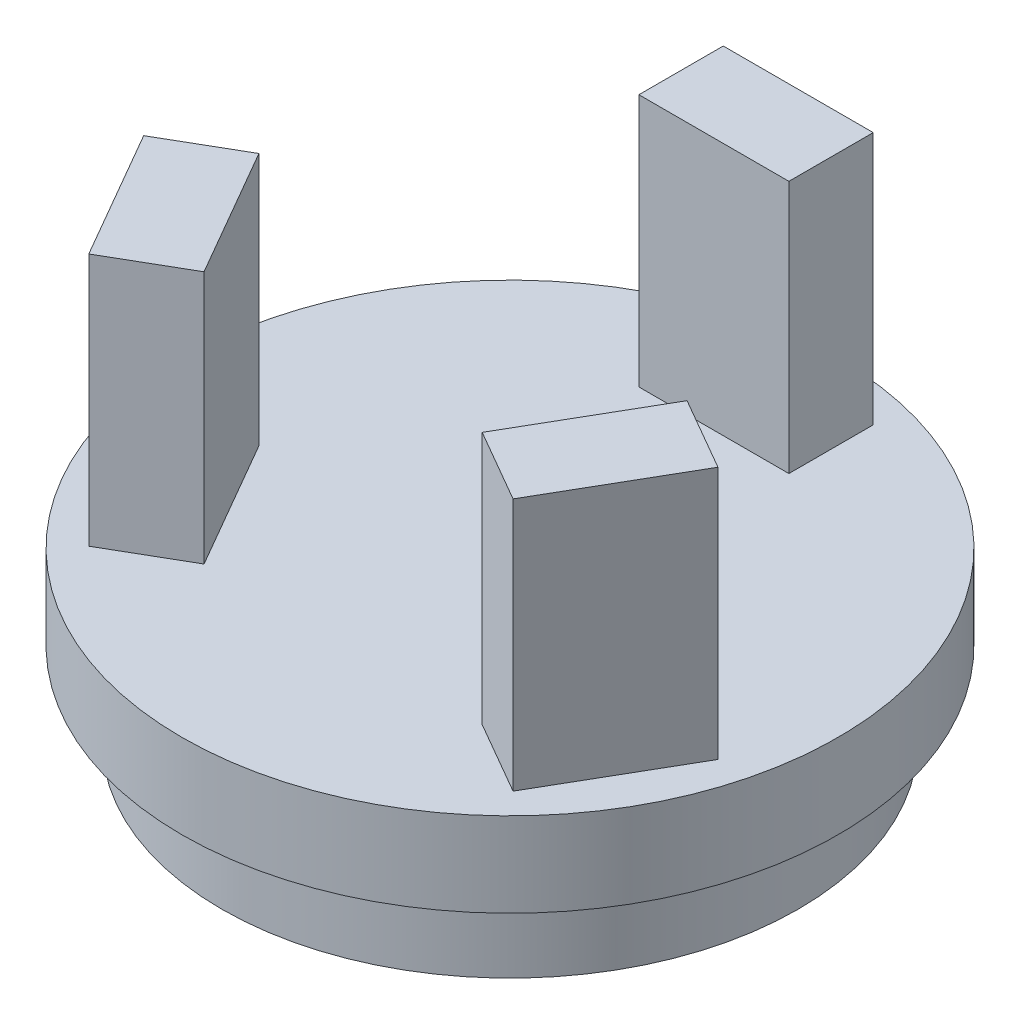
ISO-10303-21;
HEADER;
FILE_DESCRIPTION(('STEP AP214'),'2;1');
FILE_NAME('part.step','',(''),(''),'','','');
FILE_SCHEMA(('AUTOMOTIVE_DESIGN { 1 0 10303 214 1 1 1 1 }'));
ENDSEC;
DATA;
#1=APPLICATION_CONTEXT('core data for automotive mechanical design processes');
#2=APPLICATION_PROTOCOL_DEFINITION('international standard','automotive_design',2000,#1);
#3=PRODUCT_CONTEXT('',#1,'mechanical');
#4=PRODUCT('Part','Part','',(#3));
#5=PRODUCT_RELATED_PRODUCT_CATEGORY('part','',(#4));
#6=PRODUCT_DEFINITION_FORMATION('','',#4);
#7=PRODUCT_DEFINITION_CONTEXT('part definition',#1,'design');
#8=PRODUCT_DEFINITION('design','',#6,#7);
#9=PRODUCT_DEFINITION_SHAPE('','',#8);
#10=(LENGTH_UNIT() NAMED_UNIT(*) SI_UNIT(.MILLI.,.METRE.));
#11=(NAMED_UNIT(*) PLANE_ANGLE_UNIT() SI_UNIT($,.RADIAN.));
#12=(NAMED_UNIT(*) SI_UNIT($,.STERADIAN.) SOLID_ANGLE_UNIT());
#13=UNCERTAINTY_MEASURE_WITH_UNIT(LENGTH_MEASURE(1.E-05),#10,'distance_accuracy_value','');
#14=(GEOMETRIC_REPRESENTATION_CONTEXT(3) GLOBAL_UNCERTAINTY_ASSIGNED_CONTEXT((#13)) GLOBAL_UNIT_ASSIGNED_CONTEXT((#10,
#11,#12)) REPRESENTATION_CONTEXT('',''));
#15=CARTESIAN_POINT('',(0.,0.,0.));
#16=DIRECTION('',(0.,0.,1.));
#17=DIRECTION('',(1.,0.,0.));
#18=AXIS2_PLACEMENT_3D('',#15,#16,#17);
#19=CARTESIAN_POINT('',(50.8875183251901,18.,-23.7843835650345));
#20=DIRECTION('',(0.,-1.,0.));
#21=DIRECTION('',(0.,0.,-1.));
#22=AXIS2_PLACEMENT_3D('',#19,#20,#21);
#23=CYLINDRICAL_SURFACE('',#22,61.5);
#24=CARTESIAN_POINT('',(50.8875183251901,18.,-23.7843835650345));
#25=DIRECTION('',(0.,1.,0.));
#26=DIRECTION('',(0.,0.,1.));
#27=AXIS2_PLACEMENT_3D('',#24,#25,#26);
#28=CIRCLE('',#27,61.5);
#29=CARTESIAN_POINT('',(50.8875183251901,18.,37.7156164349655));
#30=VERTEX_POINT('',#29);
#31=EDGE_CURVE('E11',#30,#30,#28,.T.);
#32=ORIENTED_EDGE('',*,*,#31,.F.);
#33=EDGE_LOOP('',(#32));
#34=FACE_BOUND('',#33,.T.);
#35=CARTESIAN_POINT('',(50.8875183251901,0.,-23.7843835650345));
#36=DIRECTION('',(0.,1.,0.));
#37=DIRECTION('',(0.,0.,1.));
#38=AXIS2_PLACEMENT_3D('',#35,#36,#37);
#39=CIRCLE('',#38,61.5);
#40=CARTESIAN_POINT('',(50.8875183251901,0.,37.7156164349655));
#41=VERTEX_POINT('',#40);
#42=EDGE_CURVE('E37',#41,#41,#39,.T.);
#43=ORIENTED_EDGE('',*,*,#42,.T.);
#44=EDGE_LOOP('',(#43));
#45=FACE_BOUND('',#44,.T.);
#46=ADVANCED_FACE('F34',(#34,#45),#23,.T.);
#47=CARTESIAN_POINT('',(50.8875183251901,0.,-23.7843835650345));
#48=DIRECTION('',(0.,1.,0.));
#49=DIRECTION('',(0.,0.,1.));
#50=AXIS2_PLACEMENT_3D('',#47,#48,#49);
#51=PLANE('',#50);
#52=ORIENTED_EDGE('',*,*,#42,.F.);
#53=EDGE_LOOP('',(#52));
#54=FACE_BOUND('',#53,.T.);
#55=ADVANCED_FACE('F234',(#54),#51,.F.);
#56=CARTESIAN_POINT('',(50.8875183251901,18.,-23.7843835650345));
#57=DIRECTION('',(0.,1.,0.));
#58=DIRECTION('',(0.,0.,1.));
#59=AXIS2_PLACEMENT_3D('',#56,#57,#58);
#60=PLANE('',#59);
#61=CARTESIAN_POINT('',(50.8875183251901,18.,-23.7843835650345));
#62=DIRECTION('',(0.,1.,0.));
#63=DIRECTION('',(0.,0.,1.));
#64=AXIS2_PLACEMENT_3D('',#61,#62,#63);
#65=CIRCLE('',#64,70.);
#66=CARTESIAN_POINT('',(50.8875183251901,18.,46.2156164349655));
#67=VERTEX_POINT('',#66);
#68=EDGE_CURVE('E222',#67,#67,#65,.T.);
#69=ORIENTED_EDGE('',*,*,#68,.F.);
#70=EDGE_LOOP('',(#69));
#71=FACE_BOUND('',#70,.T.);
#72=ORIENTED_EDGE('',*,*,#31,.T.);
#73=EDGE_LOOP('',(#72));
#74=FACE_BOUND('',#73,.T.);
#75=ADVANCED_FACE('F231',(#71,#74),#60,.F.);
#76=CARTESIAN_POINT('',(50.8875183251901,36.,-23.7843835650345));
#77=DIRECTION('',(0.,-1.,0.));
#78=DIRECTION('',(0.,0.,-1.));
#79=AXIS2_PLACEMENT_3D('',#76,#77,#78);
#80=CYLINDRICAL_SURFACE('',#79,70.);
#81=CARTESIAN_POINT('',(50.8875183251901,36.,-23.7843835650345));
#82=DIRECTION('',(0.,1.,0.));
#83=DIRECTION('',(0.,0.,1.));
#84=AXIS2_PLACEMENT_3D('',#81,#82,#83);
#85=CIRCLE('',#84,70.);
#86=CARTESIAN_POINT('',(50.8875183251901,36.,46.2156164349655));
#87=VERTEX_POINT('',#86);
#88=EDGE_CURVE('E223',#87,#87,#85,.T.);
#89=ORIENTED_EDGE('',*,*,#88,.F.);
#90=EDGE_LOOP('',(#89));
#91=FACE_BOUND('',#90,.T.);
#92=ORIENTED_EDGE('',*,*,#68,.T.);
#93=EDGE_LOOP('',(#92));
#94=FACE_BOUND('',#93,.T.);
#95=ADVANCED_FACE('F229',(#91,#94),#80,.T.);
#96=CARTESIAN_POINT('',(50.8875183251901,36.,-23.7843835650345));
#97=DIRECTION('',(0.,1.,0.));
#98=DIRECTION('',(0.,0.,1.));
#99=AXIS2_PLACEMENT_3D('',#96,#97,#98);
#100=PLANE('',#99);
#101=DIRECTION('',(0.86602540378443,0.,-0.500000000000015));
#102=VECTOR('',#101,1.);
#103=CARTESIAN_POINT('',(-5.57706060903914,36.,-9.65975233174642));
#104=LINE('',#103,#102);
#105=CARTESIAN_POINT('',(-10.3730440075531,36.,-6.89079002558529));
#106=VERTEX_POINT('',#105);
#107=CARTESIAN_POINT('',(5.21541326056641,36.,-15.8907900255854));
#108=VERTEX_POINT('',#107);
#109=EDGE_CURVE('E127',#106,#108,#104,.T.);
#110=ORIENTED_EDGE('',*,*,#109,.T.);
#111=DIRECTION('',(0.5,0.,0.866025403784439));
#112=VECTOR('',#111,1.);
#113=CARTESIAN_POINT('',(10.7924738696055,36.,-6.23103769383873));
#114=LINE('',#113,#112);
#115=CARTESIAN_POINT('',(21.2154132605666,36.,11.8220228955169));
#116=VERTEX_POINT('',#115);
#117=EDGE_CURVE('E141',#108,#116,#114,.T.);
#118=ORIENTED_EDGE('',*,*,#117,.T.);
#119=DIRECTION('',(-0.866025403784439,0.,0.5));
#120=VECTOR('',#119,1.);
#121=CARTESIAN_POINT('',(10.4229393909611,36.,18.0530605893556));
#122=LINE('',#121,#120);
#123=CARTESIAN_POINT('',(5.62695599244726,36.,20.8220228955166));
#124=VERTEX_POINT('',#123);
#125=EDGE_CURVE('E53',#116,#124,#122,.T.);
#126=ORIENTED_EDGE('',*,*,#125,.T.);
#127=DIRECTION('',(-0.500000000000015,0.,-0.86602540378443));
#128=VECTOR('',#127,1.);
#129=CARTESIAN_POINT('',(-4.79598339851396,36.,2.76896230616113));
#130=LINE('',#129,#128);
#131=EDGE_CURVE('E48',#124,#106,#130,.T.);
#132=ORIENTED_EDGE('',*,*,#131,.T.);
#133=EDGE_LOOP('',(#110,#118,#126,#132));
#134=FACE_BOUND('',#133,.T.);
#135=DIRECTION('',(0.,0.,1.));
#136=VECTOR('',#135,1.);
#137=CARTESIAN_POINT('',(66.8875183251907,36.,0.));
#138=LINE('',#137,#136);
#139=CARTESIAN_POINT('',(66.8875183251907,36.,-85.2843835650338));
#140=VERTEX_POINT('',#139);
#141=CARTESIAN_POINT('',(66.8875183251907,36.,-67.2843835650339));
#142=VERTEX_POINT('',#141);
#143=EDGE_CURVE('E130',#140,#142,#138,.T.);
#144=ORIENTED_EDGE('',*,*,#143,.T.);
#145=DIRECTION('',(-1.,0.,0.));
#146=VECTOR('',#145,1.);
#147=CARTESIAN_POINT('',(-2.15931629513246E-12,36.,-67.2843835650328));
#148=LINE('',#147,#146);
#149=CARTESIAN_POINT('',(34.8875183251907,36.,-67.2843835650339));
#150=VERTEX_POINT('',#149);
#151=EDGE_CURVE('E163',#142,#150,#148,.T.);
#152=ORIENTED_EDGE('',*,*,#151,.T.);
#153=DIRECTION('',(0.,0.,-1.));
#154=VECTOR('',#153,1.);
#155=CARTESIAN_POINT('',(34.8875183251929,36.,-1.15660821042808E-12));
#156=LINE('',#155,#154);
#157=CARTESIAN_POINT('',(34.8875183251901,36.,-85.2843835650338));
#158=VERTEX_POINT('',#157);
#159=EDGE_CURVE('E176',#150,#158,#156,.T.);
#160=ORIENTED_EDGE('',*,*,#159,.T.);
#161=DIRECTION('',(1.,0.,0.));
#162=VECTOR('',#161,1.);
#163=CARTESIAN_POINT('',(0.,36.,-85.2843835650338));
#164=LINE('',#163,#162);
#165=EDGE_CURVE('E174',#158,#140,#164,.T.);
#166=ORIENTED_EDGE('',*,*,#165,.T.);
#167=EDGE_LOOP('',(#144,#152,#160,#166));
#168=FACE_BOUND('',#167,.T.);
#169=DIRECTION('',(-0.866025403784442,0.,-0.499999999999995));
#170=VECTOR('',#169,1.);
#171=CARTESIAN_POINT('',(15.0208197716338,36.,-26.0168230158053));
#172=LINE('',#171,#170);
#173=CARTESIAN_POINT('',(96.1480806579334,36.,20.8220228955161));
#174=VERTEX_POINT('',#173);
#175=CARTESIAN_POINT('',(80.5596233898137,36.,11.8220228955164));
#176=VERTEX_POINT('',#175);
#177=EDGE_CURVE('E190',#174,#176,#172,.T.);
#178=ORIENTED_EDGE('',*,*,#177,.T.);
#179=DIRECTION('',(0.499999999999973,0.,-0.866025403784454));
#180=VECTOR('',#179,1.);
#181=CARTESIAN_POINT('',(65.5388036181818,36.,37.8388459113206));
#182=LINE('',#181,#180);
#183=CARTESIAN_POINT('',(96.5596233898132,36.,-15.8907900255859));
#184=VERTEX_POINT('',#183);
#185=EDGE_CURVE('E195',#176,#184,#182,.T.);
#186=ORIENTED_EDGE('',*,*,#185,.T.);
#187=DIRECTION('',(0.866025403784486,0.,0.499999999999918));
#188=VECTOR('',#187,1.);
#189=CARTESIAN_POINT('',(31.0208197716255,36.,-53.7296359369043));
#190=LINE('',#189,#188);
#191=CARTESIAN_POINT('',(112.148080657934,36.,-6.89079002558741));
#192=VERTEX_POINT('',#191);
#193=EDGE_CURVE('E208',#184,#192,#190,.T.);
#194=ORIENTED_EDGE('',*,*,#193,.T.);
#195=DIRECTION('',(-0.499999999999995,0.,0.866025403784442));
#196=VECTOR('',#195,1.);
#197=CARTESIAN_POINT('',(81.1272608862996,36.,46.8388459113214));
#198=LINE('',#197,#196);
#199=EDGE_CURVE('E206',#192,#174,#198,.T.);
#200=ORIENTED_EDGE('',*,*,#199,.T.);
#201=EDGE_LOOP('',(#178,#186,#194,#200));
#202=FACE_BOUND('',#201,.T.);
#203=ORIENTED_EDGE('',*,*,#88,.T.);
#204=EDGE_LOOP('',(#203));
#205=FACE_BOUND('',#204,.T.);
#206=ADVANCED_FACE('F248',(#134,#168,#202,#205),#100,.T.);
#207=CARTESIAN_POINT('',(15.0208197716338,90.,-26.0168230158053));
#208=DIRECTION('',(-0.499999999999994,0.,0.866025403784442));
#209=DIRECTION('',(0.866025403784442,0.,0.499999999999995));
#210=AXIS2_PLACEMENT_3D('',#207,#208,#209);
#211=PLANE('',#210);
#212=ORIENTED_EDGE('',*,*,#177,.F.);
#213=DIRECTION('',(0.,-1.,0.));
#214=VECTOR('',#213,1.);
#215=CARTESIAN_POINT('',(96.1480806579334,90.,20.8220228955161));
#216=LINE('',#215,#214);
#217=CARTESIAN_POINT('',(96.1480806579334,90.,20.8220228955161));
#218=VERTEX_POINT('',#217);
#219=EDGE_CURVE('E219',#218,#174,#216,.T.);
#220=ORIENTED_EDGE('',*,*,#219,.F.);
#221=DIRECTION('',(-0.866025403784442,0.,-0.499999999999995));
#222=VECTOR('',#221,1.);
#223=CARTESIAN_POINT('',(15.0208197716338,90.,-26.0168230158053));
#224=LINE('',#223,#222);
#225=CARTESIAN_POINT('',(80.5596233898137,90.,11.8220228955164));
#226=VERTEX_POINT('',#225);
#227=EDGE_CURVE('E191',#218,#226,#224,.T.);
#228=ORIENTED_EDGE('',*,*,#227,.T.);
#229=DIRECTION('',(0.,-1.,0.));
#230=VECTOR('',#229,1.);
#231=CARTESIAN_POINT('',(80.5596233898137,90.,11.8220228955164));
#232=LINE('',#231,#230);
#233=EDGE_CURVE('E204',#226,#176,#232,.T.);
#234=ORIENTED_EDGE('',*,*,#233,.T.);
#235=EDGE_LOOP('',(#212,#220,#228,#234));
#236=FACE_BOUND('',#235,.T.);
#237=ADVANCED_FACE('F253',(#236),#211,.T.);
#238=CARTESIAN_POINT('',(81.1272608862996,90.,46.8388459113214));
#239=DIRECTION('',(0.866025403784442,0.,0.499999999999995));
#240=DIRECTION('',(0.499999999999995,0.,-0.866025403784442));
#241=AXIS2_PLACEMENT_3D('',#238,#239,#240);
#242=PLANE('',#241);
#243=ORIENTED_EDGE('',*,*,#199,.F.);
#244=DIRECTION('',(0.,-1.,0.));
#245=VECTOR('',#244,1.);
#246=CARTESIAN_POINT('',(112.148080657934,90.,-6.89079002558741));
#247=LINE('',#246,#245);
#248=CARTESIAN_POINT('',(112.148080657934,90.,-6.89079002558741));
#249=VERTEX_POINT('',#248);
#250=EDGE_CURVE('E216',#249,#192,#247,.T.);
#251=ORIENTED_EDGE('',*,*,#250,.F.);
#252=DIRECTION('',(-0.499999999999995,0.,0.866025403784442));
#253=VECTOR('',#252,1.);
#254=CARTESIAN_POINT('',(81.1272608862996,90.,46.8388459113214));
#255=LINE('',#254,#253);
#256=EDGE_CURVE('E194',#249,#218,#255,.T.);
#257=ORIENTED_EDGE('',*,*,#256,.T.);
#258=ORIENTED_EDGE('',*,*,#219,.T.);
#259=EDGE_LOOP('',(#243,#251,#257,#258));
#260=FACE_BOUND('',#259,.T.);
#261=ADVANCED_FACE('F256',(#260),#242,.T.);
#262=CARTESIAN_POINT('',(31.0208197716255,90.,-53.7296359369043));
#263=DIRECTION('',(0.499999999999918,0.,-0.866025403784486));
#264=DIRECTION('',(-0.866025403784486,0.,-0.499999999999918));
#265=AXIS2_PLACEMENT_3D('',#262,#263,#264);
#266=PLANE('',#265);
#267=ORIENTED_EDGE('',*,*,#193,.F.);
#268=DIRECTION('',(0.,-1.,0.));
#269=VECTOR('',#268,1.);
#270=CARTESIAN_POINT('',(96.5596233898132,90.,-15.8907900255859));
#271=LINE('',#270,#269);
#272=CARTESIAN_POINT('',(96.5596233898132,90.,-15.8907900255859));
#273=VERTEX_POINT('',#272);
#274=EDGE_CURVE('E213',#273,#184,#271,.T.);
#275=ORIENTED_EDGE('',*,*,#274,.F.);
#276=DIRECTION('',(0.866025403784486,0.,0.499999999999918));
#277=VECTOR('',#276,1.);
#278=CARTESIAN_POINT('',(31.0208197716255,90.,-53.7296359369043));
#279=LINE('',#278,#277);
#280=EDGE_CURVE('E198',#273,#249,#279,.T.);
#281=ORIENTED_EDGE('',*,*,#280,.T.);
#282=ORIENTED_EDGE('',*,*,#250,.T.);
#283=EDGE_LOOP('',(#267,#275,#281,#282));
#284=FACE_BOUND('',#283,.T.);
#285=ADVANCED_FACE('F260',(#284),#266,.T.);
#286=CARTESIAN_POINT('',(65.5388036181818,90.,37.8388459113206));
#287=DIRECTION('',(-0.866025403784454,0.,-0.499999999999973));
#288=DIRECTION('',(-0.499999999999973,0.,0.866025403784454));
#289=AXIS2_PLACEMENT_3D('',#286,#287,#288);
#290=PLANE('',#289);
#291=ORIENTED_EDGE('',*,*,#185,.F.);
#292=ORIENTED_EDGE('',*,*,#233,.F.);
#293=DIRECTION('',(0.499999999999973,0.,-0.866025403784454));
#294=VECTOR('',#293,1.);
#295=CARTESIAN_POINT('',(65.5388036181818,90.,37.8388459113206));
#296=LINE('',#295,#294);
#297=EDGE_CURVE('E201',#226,#273,#296,.T.);
#298=ORIENTED_EDGE('',*,*,#297,.T.);
#299=ORIENTED_EDGE('',*,*,#274,.T.);
#300=EDGE_LOOP('',(#291,#292,#298,#299));
#301=FACE_BOUND('',#300,.T.);
#302=ADVANCED_FACE('F264',(#301),#290,.T.);
#303=CARTESIAN_POINT('',(0.,90.,0.));
#304=DIRECTION('',(0.,1.,0.));
#305=DIRECTION('',(0.,0.,1.));
#306=AXIS2_PLACEMENT_3D('',#303,#304,#305);
#307=PLANE('',#306);
#308=ORIENTED_EDGE('',*,*,#227,.F.);
#309=ORIENTED_EDGE('',*,*,#256,.F.);
#310=ORIENTED_EDGE('',*,*,#280,.F.);
#311=ORIENTED_EDGE('',*,*,#297,.F.);
#312=EDGE_LOOP('',(#308,#309,#310,#311));
#313=FACE_BOUND('',#312,.T.);
#314=ADVANCED_FACE('F268',(#313),#307,.T.);
#315=CARTESIAN_POINT('',(66.8875183251907,90.,0.));
#316=DIRECTION('',(1.,0.,0.));
#317=DIRECTION('',(0.,0.,-1.));
#318=AXIS2_PLACEMENT_3D('',#315,#316,#317);
#319=PLANE('',#318);
#320=ORIENTED_EDGE('',*,*,#143,.F.);
#321=DIRECTION('',(0.,-1.,0.));
#322=VECTOR('',#321,1.);
#323=CARTESIAN_POINT('',(66.8875183251907,90.,-85.2843835650338));
#324=LINE('',#323,#322);
#325=CARTESIAN_POINT('',(66.8875183251907,90.,-85.2843835650338));
#326=VERTEX_POINT('',#325);
#327=EDGE_CURVE('E187',#326,#140,#324,.T.);
#328=ORIENTED_EDGE('',*,*,#327,.F.);
#329=DIRECTION('',(0.,0.,1.));
#330=VECTOR('',#329,1.);
#331=CARTESIAN_POINT('',(66.8875183251907,90.,0.));
#332=LINE('',#331,#330);
#333=CARTESIAN_POINT('',(66.8875183251907,90.,-67.2843835650339));
#334=VERTEX_POINT('',#333);
#335=EDGE_CURVE('E159',#326,#334,#332,.T.);
#336=ORIENTED_EDGE('',*,*,#335,.T.);
#337=DIRECTION('',(0.,-1.,0.));
#338=VECTOR('',#337,1.);
#339=CARTESIAN_POINT('',(66.8875183251907,90.,-67.2843835650339));
#340=LINE('',#339,#338);
#341=EDGE_CURVE('E172',#334,#142,#340,.T.);
#342=ORIENTED_EDGE('',*,*,#341,.T.);
#343=EDGE_LOOP('',(#320,#328,#336,#342));
#344=FACE_BOUND('',#343,.T.);
#345=ADVANCED_FACE('F272',(#344),#319,.T.);
#346=CARTESIAN_POINT('',(0.,90.,-85.2843835650338));
#347=DIRECTION('',(0.,0.,-1.));
#348=DIRECTION('',(-1.,0.,0.));
#349=AXIS2_PLACEMENT_3D('',#346,#347,#348);
#350=PLANE('',#349);
#351=ORIENTED_EDGE('',*,*,#165,.F.);
#352=DIRECTION('',(0.,-1.,0.));
#353=VECTOR('',#352,1.);
#354=CARTESIAN_POINT('',(34.8875183251901,90.,-85.2843835650338));
#355=LINE('',#354,#353);
#356=CARTESIAN_POINT('',(34.8875183251901,90.,-85.2843835650338));
#357=VERTEX_POINT('',#356);
#358=EDGE_CURVE('E184',#357,#158,#355,.T.);
#359=ORIENTED_EDGE('',*,*,#358,.F.);
#360=DIRECTION('',(1.,0.,0.));
#361=VECTOR('',#360,1.);
#362=CARTESIAN_POINT('',(0.,90.,-85.2843835650338));
#363=LINE('',#362,#361);
#364=EDGE_CURVE('E162',#357,#326,#363,.T.);
#365=ORIENTED_EDGE('',*,*,#364,.T.);
#366=ORIENTED_EDGE('',*,*,#327,.T.);
#367=EDGE_LOOP('',(#351,#359,#365,#366));
#368=FACE_BOUND('',#367,.T.);
#369=ADVANCED_FACE('F276',(#368),#350,.T.);
#370=CARTESIAN_POINT('',(34.8875183251929,90.,-1.15660821042808E-12));
#371=DIRECTION('',(-1.,0.,0.));
#372=DIRECTION('',(0.,0.,1.));
#373=AXIS2_PLACEMENT_3D('',#370,#371,#372);
#374=PLANE('',#373);
#375=ORIENTED_EDGE('',*,*,#159,.F.);
#376=DIRECTION('',(0.,-1.,0.));
#377=VECTOR('',#376,1.);
#378=CARTESIAN_POINT('',(34.8875183251907,90.,-67.2843835650339));
#379=LINE('',#378,#377);
#380=CARTESIAN_POINT('',(34.8875183251907,90.,-67.2843835650339));
#381=VERTEX_POINT('',#380);
#382=EDGE_CURVE('E181',#381,#150,#379,.T.);
#383=ORIENTED_EDGE('',*,*,#382,.F.);
#384=DIRECTION('',(0.,0.,-1.));
#385=VECTOR('',#384,1.);
#386=CARTESIAN_POINT('',(34.8875183251929,90.,-1.15660821042808E-12));
#387=LINE('',#386,#385);
#388=EDGE_CURVE('E166',#381,#357,#387,.T.);
#389=ORIENTED_EDGE('',*,*,#388,.T.);
#390=ORIENTED_EDGE('',*,*,#358,.T.);
#391=EDGE_LOOP('',(#375,#383,#389,#390));
#392=FACE_BOUND('',#391,.T.);
#393=ADVANCED_FACE('F280',(#392),#374,.T.);
#394=CARTESIAN_POINT('',(-2.15931629513246E-12,90.,-67.2843835650328));
#395=DIRECTION('',(0.,0.,1.));
#396=DIRECTION('',(1.,0.,0.));
#397=AXIS2_PLACEMENT_3D('',#394,#395,#396);
#398=PLANE('',#397);
#399=ORIENTED_EDGE('',*,*,#151,.F.);
#400=ORIENTED_EDGE('',*,*,#341,.F.);
#401=DIRECTION('',(-1.,0.,0.));
#402=VECTOR('',#401,1.);
#403=CARTESIAN_POINT('',(-2.15931629513246E-12,90.,-67.2843835650328));
#404=LINE('',#403,#402);
#405=EDGE_CURVE('E169',#334,#381,#404,.T.);
#406=ORIENTED_EDGE('',*,*,#405,.T.);
#407=ORIENTED_EDGE('',*,*,#382,.T.);
#408=EDGE_LOOP('',(#399,#400,#406,#407));
#409=FACE_BOUND('',#408,.T.);
#410=ADVANCED_FACE('F284',(#409),#398,.T.);
#411=CARTESIAN_POINT('',(0.,90.,0.));
#412=DIRECTION('',(0.,1.,0.));
#413=DIRECTION('',(0.,0.,1.));
#414=AXIS2_PLACEMENT_3D('',#411,#412,#413);
#415=PLANE('',#414);
#416=ORIENTED_EDGE('',*,*,#335,.F.);
#417=ORIENTED_EDGE('',*,*,#364,.F.);
#418=ORIENTED_EDGE('',*,*,#388,.F.);
#419=ORIENTED_EDGE('',*,*,#405,.F.);
#420=EDGE_LOOP('',(#416,#417,#418,#419));
#421=FACE_BOUND('',#420,.T.);
#422=ADVANCED_FACE('F288',(#421),#415,.T.);
#423=CARTESIAN_POINT('',(-5.57706060903914,90.,-9.65975233174642));
#424=DIRECTION('',(-0.500000000000015,0.,-0.86602540378443));
#425=DIRECTION('',(-0.86602540378443,0.,0.500000000000015));
#426=AXIS2_PLACEMENT_3D('',#423,#424,#425);
#427=PLANE('',#426);
#428=ORIENTED_EDGE('',*,*,#109,.F.);
#429=DIRECTION('',(0.,-1.,0.));
#430=VECTOR('',#429,1.);
#431=CARTESIAN_POINT('',(-10.3730440075531,90.,-6.89079002558529));
#432=LINE('',#431,#430);
#433=CARTESIAN_POINT('',(-10.3730440075531,90.,-6.89079002558529));
#434=VERTEX_POINT('',#433);
#435=EDGE_CURVE('E121',#434,#106,#432,.T.);
#436=ORIENTED_EDGE('',*,*,#435,.F.);
#437=DIRECTION('',(0.86602540378443,0.,-0.500000000000015));
#438=VECTOR('',#437,1.);
#439=CARTESIAN_POINT('',(-5.57706060903914,90.,-9.65975233174642));
#440=LINE('',#439,#438);
#441=CARTESIAN_POINT('',(5.21541326056641,90.,-15.8907900255854));
#442=VERTEX_POINT('',#441);
#443=EDGE_CURVE('E125',#434,#442,#440,.T.);
#444=ORIENTED_EDGE('',*,*,#443,.T.);
#445=DIRECTION('',(0.,-1.,0.));
#446=VECTOR('',#445,1.);
#447=CARTESIAN_POINT('',(5.21541326056641,90.,-15.8907900255854));
#448=LINE('',#447,#446);
#449=EDGE_CURVE('E149',#442,#108,#448,.T.);
#450=ORIENTED_EDGE('',*,*,#449,.T.);
#451=EDGE_LOOP('',(#428,#436,#444,#450));
#452=FACE_BOUND('',#451,.T.);
#453=ADVANCED_FACE('F123',(#452),#427,.T.);
#454=CARTESIAN_POINT('',(-4.79598339851396,90.,2.76896230616113));
#455=DIRECTION('',(-0.86602540378443,0.,0.500000000000015));
#456=DIRECTION('',(0.500000000000015,0.,0.86602540378443));
#457=AXIS2_PLACEMENT_3D('',#454,#455,#456);
#458=PLANE('',#457);
#459=ORIENTED_EDGE('',*,*,#131,.F.);
#460=DIRECTION('',(0.,-1.,0.));
#461=VECTOR('',#460,1.);
#462=CARTESIAN_POINT('',(5.62695599244726,90.,20.8220228955166));
#463=LINE('',#462,#461);
#464=CARTESIAN_POINT('',(5.62695599244726,90.,20.8220228955166));
#465=VERTEX_POINT('',#464);
#466=EDGE_CURVE('E131',#465,#124,#463,.T.);
#467=ORIENTED_EDGE('',*,*,#466,.F.);
#468=DIRECTION('',(-0.500000000000015,0.,-0.86602540378443));
#469=VECTOR('',#468,1.);
#470=CARTESIAN_POINT('',(-4.79598339851396,90.,2.76896230616113));
#471=LINE('',#470,#469);
#472=EDGE_CURVE('E137',#465,#434,#471,.T.);
#473=ORIENTED_EDGE('',*,*,#472,.T.);
#474=ORIENTED_EDGE('',*,*,#435,.T.);
#475=EDGE_LOOP('',(#459,#467,#473,#474));
#476=FACE_BOUND('',#475,.T.);
#477=ADVANCED_FACE('F143',(#476),#458,.T.);
#478=CARTESIAN_POINT('',(10.4229393909611,90.,18.0530605893556));
#479=DIRECTION('',(0.5,0.,0.866025403784439));
#480=DIRECTION('',(0.866025403784439,0.,-0.5));
#481=AXIS2_PLACEMENT_3D('',#478,#479,#480);
#482=PLANE('',#481);
#483=ORIENTED_EDGE('',*,*,#125,.F.);
#484=DIRECTION('',(0.,-1.,0.));
#485=VECTOR('',#484,1.);
#486=CARTESIAN_POINT('',(21.2154132605666,90.,11.8220228955169));
#487=LINE('',#486,#485);
#488=CARTESIAN_POINT('',(21.2154132605666,90.,11.8220228955169));
#489=VERTEX_POINT('',#488);
#490=EDGE_CURVE('E155',#489,#116,#487,.T.);
#491=ORIENTED_EDGE('',*,*,#490,.F.);
#492=DIRECTION('',(-0.866025403784439,0.,0.5));
#493=VECTOR('',#492,1.);
#494=CARTESIAN_POINT('',(10.4229393909611,90.,18.0530605893556));
#495=LINE('',#494,#493);
#496=EDGE_CURVE('E144',#489,#465,#495,.T.);
#497=ORIENTED_EDGE('',*,*,#496,.T.);
#498=ORIENTED_EDGE('',*,*,#466,.T.);
#499=EDGE_LOOP('',(#483,#491,#497,#498));
#500=FACE_BOUND('',#499,.T.);
#501=ADVANCED_FACE('F297',(#500),#482,.T.);
#502=CARTESIAN_POINT('',(10.7924738696055,90.,-6.23103769383873));
#503=DIRECTION('',(0.866025403784439,0.,-0.5));
#504=DIRECTION('',(-0.5,0.,-0.866025403784439));
#505=AXIS2_PLACEMENT_3D('',#502,#503,#504);
#506=PLANE('',#505);
#507=ORIENTED_EDGE('',*,*,#117,.F.);
#508=ORIENTED_EDGE('',*,*,#449,.F.);
#509=DIRECTION('',(0.5,0.,0.866025403784439));
#510=VECTOR('',#509,1.);
#511=CARTESIAN_POINT('',(10.7924738696055,90.,-6.23103769383873));
#512=LINE('',#511,#510);
#513=EDGE_CURVE('E140',#442,#489,#512,.T.);
#514=ORIENTED_EDGE('',*,*,#513,.T.);
#515=ORIENTED_EDGE('',*,*,#490,.T.);
#516=EDGE_LOOP('',(#507,#508,#514,#515));
#517=FACE_BOUND('',#516,.T.);
#518=ADVANCED_FACE('F300',(#517),#506,.T.);
#519=CARTESIAN_POINT('',(0.,90.,0.));
#520=DIRECTION('',(0.,1.,0.));
#521=DIRECTION('',(0.,0.,1.));
#522=AXIS2_PLACEMENT_3D('',#519,#520,#521);
#523=PLANE('',#522);
#524=ORIENTED_EDGE('',*,*,#443,.F.);
#525=ORIENTED_EDGE('',*,*,#472,.F.);
#526=ORIENTED_EDGE('',*,*,#496,.F.);
#527=ORIENTED_EDGE('',*,*,#513,.F.);
#528=EDGE_LOOP('',(#524,#525,#526,#527));
#529=FACE_BOUND('',#528,.T.);
#530=ADVANCED_FACE('F135',(#529),#523,.T.);
#531=CLOSED_SHELL('',(#46,#55,#75,#95,#206,#237,#261,#285,#302,#314,#345,#369,#393,#410,#422,
#453,#477,#501,#518,#530));
#532=MANIFOLD_SOLID_BREP('B2',#531);
#533=ADVANCED_BREP_SHAPE_REPRESENTATION('',(#18,#532),#14);
#534=SHAPE_DEFINITION_REPRESENTATION(#9,#533);
ENDSEC;
END-ISO-10303-21;
